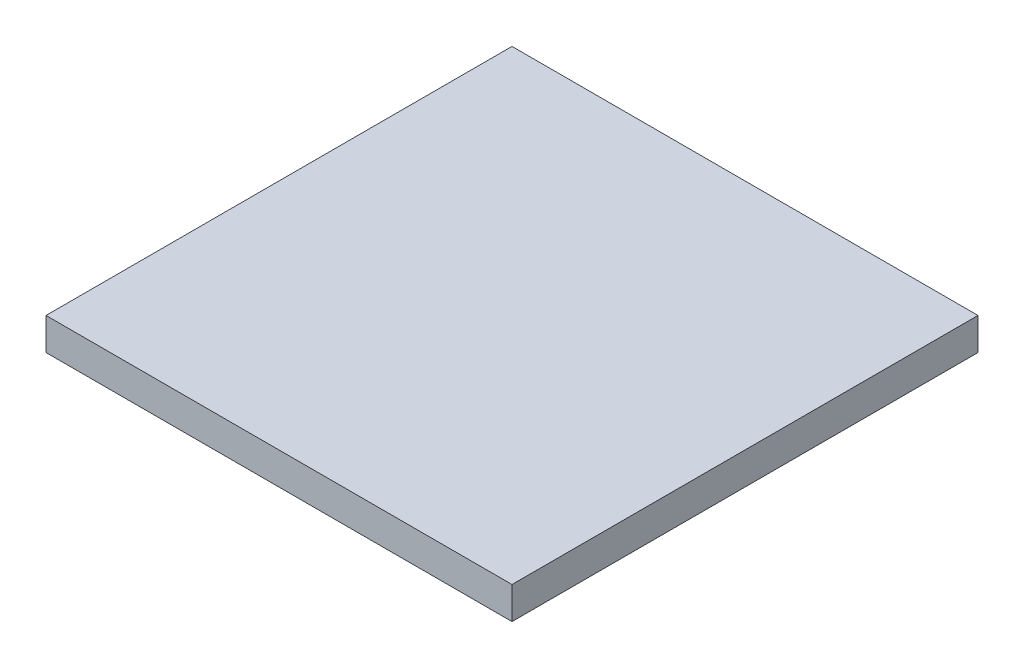
ISO-10303-21;
HEADER;
FILE_DESCRIPTION(('STEP AP214'),'2;1');
FILE_NAME('part.step','',(''),(''),'','','');
FILE_SCHEMA(('AUTOMOTIVE_DESIGN { 1 0 10303 214 1 1 1 1 }'));
ENDSEC;
DATA;
#1=APPLICATION_CONTEXT('core data for automotive mechanical design processes');
#2=APPLICATION_PROTOCOL_DEFINITION('international standard','automotive_design',2000,#1);
#3=PRODUCT_CONTEXT('',#1,'mechanical');
#4=PRODUCT('Part','Part','',(#3));
#5=PRODUCT_RELATED_PRODUCT_CATEGORY('part','',(#4));
#6=PRODUCT_DEFINITION_FORMATION('','',#4);
#7=PRODUCT_DEFINITION_CONTEXT('part definition',#1,'design');
#8=PRODUCT_DEFINITION('design','',#6,#7);
#9=PRODUCT_DEFINITION_SHAPE('','',#8);
#10=(LENGTH_UNIT() NAMED_UNIT(*) SI_UNIT(.MILLI.,.METRE.));
#11=(NAMED_UNIT(*) PLANE_ANGLE_UNIT() SI_UNIT($,.RADIAN.));
#12=(NAMED_UNIT(*) SI_UNIT($,.STERADIAN.) SOLID_ANGLE_UNIT());
#13=UNCERTAINTY_MEASURE_WITH_UNIT(LENGTH_MEASURE(1.E-05),#10,'distance_accuracy_value','');
#14=(GEOMETRIC_REPRESENTATION_CONTEXT(3) GLOBAL_UNCERTAINTY_ASSIGNED_CONTEXT((#13)) GLOBAL_UNIT_ASSIGNED_CONTEXT((#10,
#11,#12)) REPRESENTATION_CONTEXT('',''));
#15=CARTESIAN_POINT('',(0.,0.,0.));
#16=DIRECTION('',(0.,0.,1.));
#17=DIRECTION('',(1.,0.,0.));
#18=AXIS2_PLACEMENT_3D('',#15,#16,#17);
#19=CARTESIAN_POINT('',(29.,4.,-29.));
#20=DIRECTION('',(-1.,0.,0.));
#21=DIRECTION('',(0.,0.,1.));
#22=AXIS2_PLACEMENT_3D('',#19,#20,#21);
#23=PLANE('',#22);
#24=DIRECTION('',(0.,0.,-1.));
#25=VECTOR('',#24,1.);
#26=CARTESIAN_POINT('',(29.,0.,-29.));
#27=LINE('',#26,#25);
#28=CARTESIAN_POINT('',(29.,0.,29.));
#29=VERTEX_POINT('',#28);
#30=CARTESIAN_POINT('',(29.,0.,-29.));
#31=VERTEX_POINT('',#30);
#32=EDGE_CURVE('E97',#29,#31,#27,.T.);
#33=ORIENTED_EDGE('',*,*,#32,.T.);
#34=DIRECTION('',(0.,-1.,0.));
#35=VECTOR('',#34,1.);
#36=CARTESIAN_POINT('',(29.,4.,-29.));
#37=LINE('',#36,#35);
#38=CARTESIAN_POINT('',(29.,4.,-29.));
#39=VERTEX_POINT('',#38);
#40=EDGE_CURVE('E11',#39,#31,#37,.T.);
#41=ORIENTED_EDGE('',*,*,#40,.F.);
#42=DIRECTION('',(0.,0.,-1.));
#43=VECTOR('',#42,1.);
#44=CARTESIAN_POINT('',(29.,4.,-29.));
#45=LINE('',#44,#43);
#46=CARTESIAN_POINT('',(29.,4.,29.));
#47=VERTEX_POINT('',#46);
#48=EDGE_CURVE('E85',#47,#39,#45,.T.);
#49=ORIENTED_EDGE('',*,*,#48,.F.);
#50=DIRECTION('',(0.,-1.,0.));
#51=VECTOR('',#50,1.);
#52=CARTESIAN_POINT('',(29.,4.,29.));
#53=LINE('',#52,#51);
#54=EDGE_CURVE('E93',#47,#29,#53,.T.);
#55=ORIENTED_EDGE('',*,*,#54,.T.);
#56=EDGE_LOOP('',(#33,#41,#49,#55));
#57=FACE_BOUND('',#56,.T.);
#58=ADVANCED_FACE('F34',(#57),#23,.F.);
#59=CARTESIAN_POINT('',(-29.,4.,-29.));
#60=DIRECTION('',(0.,0.,1.));
#61=DIRECTION('',(1.,0.,0.));
#62=AXIS2_PLACEMENT_3D('',#59,#60,#61);
#63=PLANE('',#62);
#64=DIRECTION('',(-1.,0.,0.));
#65=VECTOR('',#64,1.);
#66=CARTESIAN_POINT('',(-29.,0.,-29.));
#67=LINE('',#66,#65);
#68=CARTESIAN_POINT('',(-29.,0.,-29.));
#69=VERTEX_POINT('',#68);
#70=EDGE_CURVE('E89',#31,#69,#67,.T.);
#71=ORIENTED_EDGE('',*,*,#70,.T.);
#72=DIRECTION('',(0.,-1.,0.));
#73=VECTOR('',#72,1.);
#74=CARTESIAN_POINT('',(-29.,4.,-29.));
#75=LINE('',#74,#73);
#76=CARTESIAN_POINT('',(-29.,4.,-29.));
#77=VERTEX_POINT('',#76);
#78=EDGE_CURVE('E42',#77,#69,#75,.T.);
#79=ORIENTED_EDGE('',*,*,#78,.F.);
#80=DIRECTION('',(-1.,0.,0.));
#81=VECTOR('',#80,1.);
#82=CARTESIAN_POINT('',(-29.,4.,-29.));
#83=LINE('',#82,#81);
#84=EDGE_CURVE('E80',#39,#77,#83,.T.);
#85=ORIENTED_EDGE('',*,*,#84,.F.);
#86=ORIENTED_EDGE('',*,*,#40,.T.);
#87=EDGE_LOOP('',(#71,#79,#85,#86));
#88=FACE_BOUND('',#87,.T.);
#89=ADVANCED_FACE('F88',(#88),#63,.F.);
#90=CARTESIAN_POINT('',(-29.,4.,-29.));
#91=DIRECTION('',(1.,0.,0.));
#92=DIRECTION('',(0.,0.,-1.));
#93=AXIS2_PLACEMENT_3D('',#90,#91,#92);
#94=PLANE('',#93);
#95=DIRECTION('',(0.,0.,1.));
#96=VECTOR('',#95,1.);
#97=CARTESIAN_POINT('',(-29.,0.,-29.));
#98=LINE('',#97,#96);
#99=CARTESIAN_POINT('',(-29.,0.,29.));
#100=VERTEX_POINT('',#99);
#101=EDGE_CURVE('E67',#69,#100,#98,.T.);
#102=ORIENTED_EDGE('',*,*,#101,.T.);
#103=DIRECTION('',(0.,-1.,0.));
#104=VECTOR('',#103,1.);
#105=CARTESIAN_POINT('',(-29.,4.,29.));
#106=LINE('',#105,#104);
#107=CARTESIAN_POINT('',(-29.,4.,29.));
#108=VERTEX_POINT('',#107);
#109=EDGE_CURVE('E90',#108,#100,#106,.T.);
#110=ORIENTED_EDGE('',*,*,#109,.F.);
#111=DIRECTION('',(0.,0.,1.));
#112=VECTOR('',#111,1.);
#113=CARTESIAN_POINT('',(-29.,4.,-29.));
#114=LINE('',#113,#112);
#115=EDGE_CURVE('E83',#77,#108,#114,.T.);
#116=ORIENTED_EDGE('',*,*,#115,.F.);
#117=ORIENTED_EDGE('',*,*,#78,.T.);
#118=EDGE_LOOP('',(#102,#110,#116,#117));
#119=FACE_BOUND('',#118,.T.);
#120=ADVANCED_FACE('F91',(#119),#94,.F.);
#121=CARTESIAN_POINT('',(-29.,4.,29.));
#122=DIRECTION('',(0.,0.,-1.));
#123=DIRECTION('',(-1.,0.,0.));
#124=AXIS2_PLACEMENT_3D('',#121,#122,#123);
#125=PLANE('',#124);
#126=DIRECTION('',(1.,0.,0.));
#127=VECTOR('',#126,1.);
#128=CARTESIAN_POINT('',(-29.,0.,29.));
#129=LINE('',#128,#127);
#130=EDGE_CURVE('E73',#100,#29,#129,.T.);
#131=ORIENTED_EDGE('',*,*,#130,.T.);
#132=ORIENTED_EDGE('',*,*,#54,.F.);
#133=DIRECTION('',(1.,0.,0.));
#134=VECTOR('',#133,1.);
#135=CARTESIAN_POINT('',(-29.,4.,29.));
#136=LINE('',#135,#134);
#137=EDGE_CURVE('E50',#108,#47,#136,.T.);
#138=ORIENTED_EDGE('',*,*,#137,.F.);
#139=ORIENTED_EDGE('',*,*,#109,.T.);
#140=EDGE_LOOP('',(#131,#132,#138,#139));
#141=FACE_BOUND('',#140,.T.);
#142=ADVANCED_FACE('F104',(#141),#125,.F.);
#143=CARTESIAN_POINT('',(0.,4.,0.));
#144=DIRECTION('',(0.,1.,0.));
#145=DIRECTION('',(0.,0.,1.));
#146=AXIS2_PLACEMENT_3D('',#143,#144,#145);
#147=PLANE('',#146);
#148=ORIENTED_EDGE('',*,*,#48,.T.);
#149=ORIENTED_EDGE('',*,*,#84,.T.);
#150=ORIENTED_EDGE('',*,*,#115,.T.);
#151=ORIENTED_EDGE('',*,*,#137,.T.);
#152=EDGE_LOOP('',(#148,#149,#150,#151));
#153=FACE_BOUND('',#152,.T.);
#154=ADVANCED_FACE('F81',(#153),#147,.T.);
#155=CARTESIAN_POINT('',(0.,0.,0.));
#156=DIRECTION('',(0.,1.,0.));
#157=DIRECTION('',(0.,0.,1.));
#158=AXIS2_PLACEMENT_3D('',#155,#156,#157);
#159=PLANE('',#158);
#160=ORIENTED_EDGE('',*,*,#32,.F.);
#161=ORIENTED_EDGE('',*,*,#130,.F.);
#162=ORIENTED_EDGE('',*,*,#101,.F.);
#163=ORIENTED_EDGE('',*,*,#70,.F.);
#164=EDGE_LOOP('',(#160,#161,#162,#163));
#165=FACE_BOUND('',#164,.T.);
#166=ADVANCED_FACE('F107',(#165),#159,.F.);
#167=CLOSED_SHELL('',(#58,#89,#120,#142,#154,#166));
#168=MANIFOLD_SOLID_BREP('B2',#167);
#169=ADVANCED_BREP_SHAPE_REPRESENTATION('',(#18,#168),#14);
#170=SHAPE_DEFINITION_REPRESENTATION(#9,#169);
ENDSEC;
END-ISO-10303-21;
